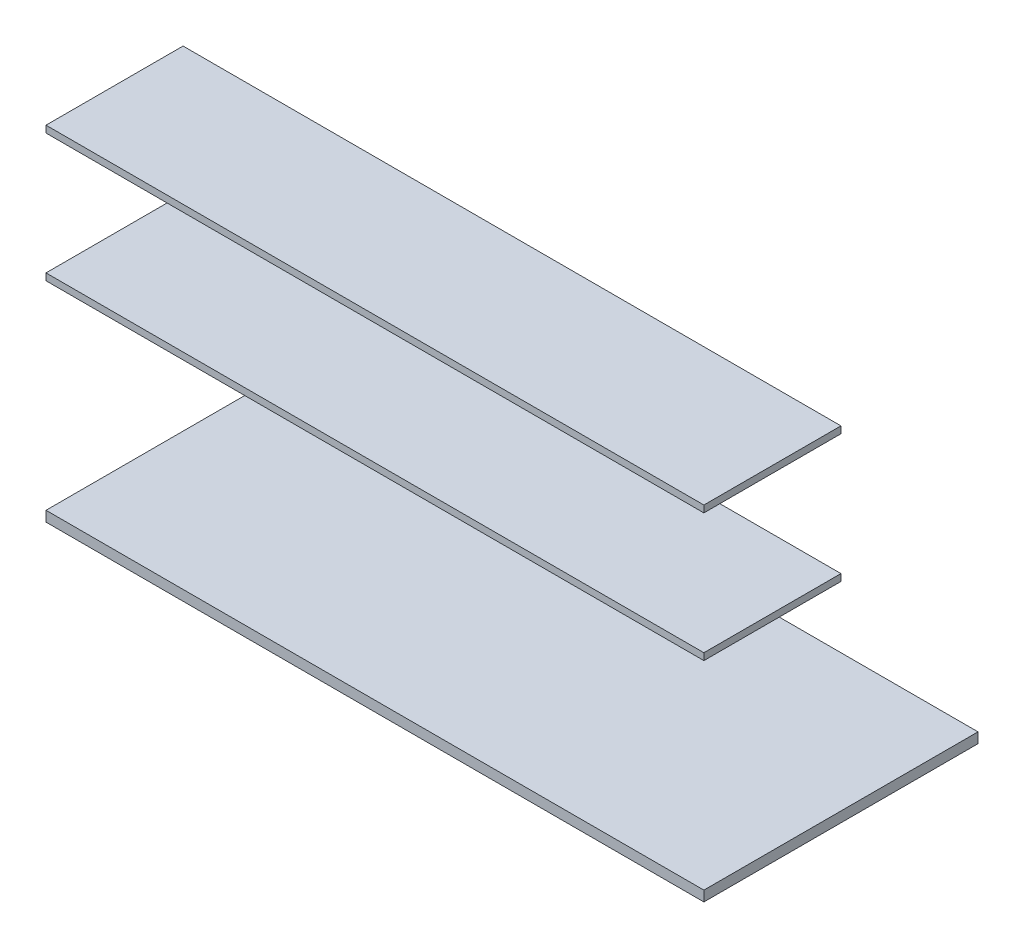
ISO-10303-21;
HEADER;
FILE_DESCRIPTION(('STEP AP214'),'2;1');
FILE_NAME('part.step','',(''),(''),'','','');
FILE_SCHEMA(('AUTOMOTIVE_DESIGN { 1 0 10303 214 1 1 1 1 }'));
ENDSEC;
DATA;
#1=APPLICATION_CONTEXT('core data for automotive mechanical design processes');
#2=APPLICATION_PROTOCOL_DEFINITION('international standard','automotive_design',2000,#1);
#3=PRODUCT_CONTEXT('',#1,'mechanical');
#4=PRODUCT('Part','Part','',(#3));
#5=PRODUCT_RELATED_PRODUCT_CATEGORY('part','',(#4));
#6=PRODUCT_DEFINITION_FORMATION('','',#4);
#7=PRODUCT_DEFINITION_CONTEXT('part definition',#1,'design');
#8=PRODUCT_DEFINITION('design','',#6,#7);
#9=PRODUCT_DEFINITION_SHAPE('','',#8);
#10=(LENGTH_UNIT() NAMED_UNIT(*) SI_UNIT(.MILLI.,.METRE.));
#11=(NAMED_UNIT(*) PLANE_ANGLE_UNIT() SI_UNIT($,.RADIAN.));
#12=(NAMED_UNIT(*) SI_UNIT($,.STERADIAN.) SOLID_ANGLE_UNIT());
#13=UNCERTAINTY_MEASURE_WITH_UNIT(LENGTH_MEASURE(1.E-05),#10,'distance_accuracy_value','');
#14=(GEOMETRIC_REPRESENTATION_CONTEXT(3) GLOBAL_UNCERTAINTY_ASSIGNED_CONTEXT((#13)) GLOBAL_UNIT_ASSIGNED_CONTEXT((#10,
#11,#12)) REPRESENTATION_CONTEXT('',''));
#15=CARTESIAN_POINT('',(0.,0.,0.));
#16=DIRECTION('',(0.,0.,1.));
#17=DIRECTION('',(1.,0.,0.));
#18=AXIS2_PLACEMENT_3D('',#15,#16,#17);
#19=CARTESIAN_POINT('',(-1828.8,936.625,0.));
#20=DIRECTION('',(0.,0.,1.));
#21=DIRECTION('',(1.,0.,0.));
#22=AXIS2_PLACEMENT_3D('',#19,#20,#21);
#23=PLANE('',#22);
#24=DIRECTION('',(0.,-1.,0.));
#25=VECTOR('',#24,1.);
#26=CARTESIAN_POINT('',(0.,936.625,0.));
#27=LINE('',#26,#25);
#28=CARTESIAN_POINT('',(0.,955.675,0.));
#29=VERTEX_POINT('',#28);
#30=CARTESIAN_POINT('',(0.,936.625,0.));
#31=VERTEX_POINT('',#30);
#32=EDGE_CURVE('E109',#29,#31,#27,.T.);
#33=ORIENTED_EDGE('',*,*,#32,.F.);
#34=DIRECTION('',(1.,0.,0.));
#35=VECTOR('',#34,1.);
#36=CARTESIAN_POINT('',(-1828.8,955.675,0.));
#37=LINE('',#36,#35);
#38=CARTESIAN_POINT('',(-1828.8,955.675,0.));
#39=VERTEX_POINT('',#38);
#40=EDGE_CURVE('E12',#39,#29,#37,.T.);
#41=ORIENTED_EDGE('',*,*,#40,.F.);
#42=DIRECTION('',(0.,-1.,0.));
#43=VECTOR('',#42,1.);
#44=CARTESIAN_POINT('',(-1828.8,936.625,0.));
#45=LINE('',#44,#43);
#46=CARTESIAN_POINT('',(-1828.8,936.625,0.));
#47=VERTEX_POINT('',#46);
#48=EDGE_CURVE('E103',#39,#47,#45,.T.);
#49=ORIENTED_EDGE('',*,*,#48,.T.);
#50=DIRECTION('',(1.,0.,0.));
#51=VECTOR('',#50,1.);
#52=CARTESIAN_POINT('',(-1828.8,936.625,0.));
#53=LINE('',#52,#51);
#54=EDGE_CURVE('E48',#47,#31,#53,.T.);
#55=ORIENTED_EDGE('',*,*,#54,.T.);
#56=EDGE_LOOP('',(#33,#41,#49,#55));
#57=FACE_BOUND('',#56,.T.);
#58=ADVANCED_FACE('F45',(#57),#23,.T.);
#59=CARTESIAN_POINT('',(-1828.8,955.675,0.));
#60=DIRECTION('',(0.,1.,0.));
#61=DIRECTION('',(0.,0.,1.));
#62=AXIS2_PLACEMENT_3D('',#59,#60,#61);
#63=PLANE('',#62);
#64=DIRECTION('',(0.,0.,1.));
#65=VECTOR('',#64,1.);
#66=CARTESIAN_POINT('',(0.,955.675,0.));
#67=LINE('',#66,#65);
#68=CARTESIAN_POINT('',(0.,955.675,-381.));
#69=VERTEX_POINT('',#68);
#70=EDGE_CURVE('E105',#69,#29,#67,.T.);
#71=ORIENTED_EDGE('',*,*,#70,.F.);
#72=DIRECTION('',(1.,0.,0.));
#73=VECTOR('',#72,1.);
#74=CARTESIAN_POINT('',(-1828.8,955.675,-381.));
#75=LINE('',#74,#73);
#76=CARTESIAN_POINT('',(-1828.8,955.675,-381.));
#77=VERTEX_POINT('',#76);
#78=EDGE_CURVE('E54',#77,#69,#75,.T.);
#79=ORIENTED_EDGE('',*,*,#78,.F.);
#80=DIRECTION('',(0.,0.,1.));
#81=VECTOR('',#80,1.);
#82=CARTESIAN_POINT('',(-1828.8,955.675,0.));
#83=LINE('',#82,#81);
#84=EDGE_CURVE('E100',#77,#39,#83,.T.);
#85=ORIENTED_EDGE('',*,*,#84,.T.);
#86=ORIENTED_EDGE('',*,*,#40,.T.);
#87=EDGE_LOOP('',(#71,#79,#85,#86));
#88=FACE_BOUND('',#87,.T.);
#89=ADVANCED_FACE('F119',(#88),#63,.T.);
#90=CARTESIAN_POINT('',(-1828.8,936.625,-381.));
#91=DIRECTION('',(0.,0.,-1.));
#92=DIRECTION('',(-1.,0.,0.));
#93=AXIS2_PLACEMENT_3D('',#90,#91,#92);
#94=PLANE('',#93);
#95=DIRECTION('',(0.,1.,0.));
#96=VECTOR('',#95,1.);
#97=CARTESIAN_POINT('',(0.,936.625,-381.));
#98=LINE('',#97,#96);
#99=CARTESIAN_POINT('',(0.,936.625,-381.));
#100=VERTEX_POINT('',#99);
#101=EDGE_CURVE('E95',#100,#69,#98,.T.);
#102=ORIENTED_EDGE('',*,*,#101,.F.);
#103=DIRECTION('',(1.,0.,0.));
#104=VECTOR('',#103,1.);
#105=CARTESIAN_POINT('',(-1828.8,936.625,-381.));
#106=LINE('',#105,#104);
#107=CARTESIAN_POINT('',(-1828.8,936.625,-381.));
#108=VERTEX_POINT('',#107);
#109=EDGE_CURVE('E90',#108,#100,#106,.T.);
#110=ORIENTED_EDGE('',*,*,#109,.F.);
#111=DIRECTION('',(0.,1.,0.));
#112=VECTOR('',#111,1.);
#113=CARTESIAN_POINT('',(-1828.8,936.625,-381.));
#114=LINE('',#113,#112);
#115=EDGE_CURVE('E93',#108,#77,#114,.T.);
#116=ORIENTED_EDGE('',*,*,#115,.T.);
#117=ORIENTED_EDGE('',*,*,#78,.T.);
#118=EDGE_LOOP('',(#102,#110,#116,#117));
#119=FACE_BOUND('',#118,.T.);
#120=ADVANCED_FACE('F92',(#119),#94,.T.);
#121=CARTESIAN_POINT('',(-1828.8,936.625,0.));
#122=DIRECTION('',(0.,-1.,0.));
#123=DIRECTION('',(0.,0.,-1.));
#124=AXIS2_PLACEMENT_3D('',#121,#122,#123);
#125=PLANE('',#124);
#126=DIRECTION('',(0.,0.,-1.));
#127=VECTOR('',#126,1.);
#128=CARTESIAN_POINT('',(0.,936.625,0.));
#129=LINE('',#128,#127);
#130=EDGE_CURVE('E112',#31,#100,#129,.T.);
#131=ORIENTED_EDGE('',*,*,#130,.F.);
#132=ORIENTED_EDGE('',*,*,#54,.F.);
#133=DIRECTION('',(0.,0.,-1.));
#134=VECTOR('',#133,1.);
#135=CARTESIAN_POINT('',(-1828.8,936.625,0.));
#136=LINE('',#135,#134);
#137=EDGE_CURVE('E99',#47,#108,#136,.T.);
#138=ORIENTED_EDGE('',*,*,#137,.T.);
#139=ORIENTED_EDGE('',*,*,#109,.T.);
#140=EDGE_LOOP('',(#131,#132,#138,#139));
#141=FACE_BOUND('',#140,.T.);
#142=ADVANCED_FACE('F102',(#141),#125,.T.);
#143=CARTESIAN_POINT('',(-1828.8,0.,0.));
#144=DIRECTION('',(-1.,0.,0.));
#145=DIRECTION('',(0.,0.,1.));
#146=AXIS2_PLACEMENT_3D('',#143,#144,#145);
#147=PLANE('',#146);
#148=ORIENTED_EDGE('',*,*,#48,.F.);
#149=ORIENTED_EDGE('',*,*,#84,.F.);
#150=ORIENTED_EDGE('',*,*,#115,.F.);
#151=ORIENTED_EDGE('',*,*,#137,.F.);
#152=EDGE_LOOP('',(#148,#149,#150,#151));
#153=FACE_BOUND('',#152,.T.);
#154=ADVANCED_FACE('F98',(#153),#147,.T.);
#155=CARTESIAN_POINT('',(0.,0.,0.));
#156=DIRECTION('',(-1.,0.,0.));
#157=DIRECTION('',(0.,0.,1.));
#158=AXIS2_PLACEMENT_3D('',#155,#156,#157);
#159=PLANE('',#158);
#160=ORIENTED_EDGE('',*,*,#32,.T.);
#161=ORIENTED_EDGE('',*,*,#130,.T.);
#162=ORIENTED_EDGE('',*,*,#101,.T.);
#163=ORIENTED_EDGE('',*,*,#70,.T.);
#164=EDGE_LOOP('',(#160,#161,#162,#163));
#165=FACE_BOUND('',#164,.T.);
#166=ADVANCED_FACE('F118',(#165),#159,.F.);
#167=CLOSED_SHELL('',(#58,#89,#120,#142,#154,#166));
#168=MANIFOLD_SOLID_BREP('B2',#167);
#169=CARTESIAN_POINT('',(-1828.8,581.025,-381.));
#170=DIRECTION('',(0.,-1.,0.));
#171=DIRECTION('',(0.,0.,-1.));
#172=AXIS2_PLACEMENT_3D('',#169,#170,#171);
#173=PLANE('',#172);
#174=DIRECTION('',(0.,0.,-1.));
#175=VECTOR('',#174,1.);
#176=CARTESIAN_POINT('',(0.,581.025,-381.));
#177=LINE('',#176,#175);
#178=CARTESIAN_POINT('',(0.,581.025,0.));
#179=VERTEX_POINT('',#178);
#180=CARTESIAN_POINT('',(0.,581.025,-381.));
#181=VERTEX_POINT('',#180);
#182=EDGE_CURVE('E241',#179,#181,#177,.T.);
#183=ORIENTED_EDGE('',*,*,#182,.F.);
#184=DIRECTION('',(1.,0.,0.));
#185=VECTOR('',#184,1.);
#186=CARTESIAN_POINT('',(-1828.8,581.025,0.));
#187=LINE('',#186,#185);
#188=CARTESIAN_POINT('',(-1828.8,581.025,0.));
#189=VERTEX_POINT('',#188);
#190=EDGE_CURVE('E43',#189,#179,#187,.T.);
#191=ORIENTED_EDGE('',*,*,#190,.F.);
#192=DIRECTION('',(0.,0.,-1.));
#193=VECTOR('',#192,1.);
#194=CARTESIAN_POINT('',(-1828.8,581.025,-381.));
#195=LINE('',#194,#193);
#196=CARTESIAN_POINT('',(-1828.8,581.025,-381.));
#197=VERTEX_POINT('',#196);
#198=EDGE_CURVE('E235',#189,#197,#195,.T.);
#199=ORIENTED_EDGE('',*,*,#198,.T.);
#200=DIRECTION('',(1.,0.,0.));
#201=VECTOR('',#200,1.);
#202=CARTESIAN_POINT('',(-1828.8,581.025,-381.));
#203=LINE('',#202,#201);
#204=EDGE_CURVE('E180',#197,#181,#203,.T.);
#205=ORIENTED_EDGE('',*,*,#204,.T.);
#206=EDGE_LOOP('',(#183,#191,#199,#205));
#207=FACE_BOUND('',#206,.T.);
#208=ADVANCED_FACE('F177',(#207),#173,.T.);
#209=CARTESIAN_POINT('',(-1828.8,581.025,0.));
#210=DIRECTION('',(0.,0.,1.));
#211=DIRECTION('',(0.,-1.,0.));
#212=AXIS2_PLACEMENT_3D('',#209,#210,#211);
#213=PLANE('',#212);
#214=DIRECTION('',(0.,-1.,0.));
#215=VECTOR('',#214,1.);
#216=CARTESIAN_POINT('',(0.,581.025,0.));
#217=LINE('',#216,#215);
#218=CARTESIAN_POINT('',(0.,600.075,0.));
#219=VERTEX_POINT('',#218);
#220=EDGE_CURVE('E237',#219,#179,#217,.T.);
#221=ORIENTED_EDGE('',*,*,#220,.F.);
#222=DIRECTION('',(1.,0.,0.));
#223=VECTOR('',#222,1.);
#224=CARTESIAN_POINT('',(-1828.8,600.075,0.));
#225=LINE('',#224,#223);
#226=CARTESIAN_POINT('',(-1828.8,600.075,0.));
#227=VERTEX_POINT('',#226);
#228=EDGE_CURVE('E186',#227,#219,#225,.T.);
#229=ORIENTED_EDGE('',*,*,#228,.F.);
#230=DIRECTION('',(0.,-1.,0.));
#231=VECTOR('',#230,1.);
#232=CARTESIAN_POINT('',(-1828.8,581.025,0.));
#233=LINE('',#232,#231);
#234=EDGE_CURVE('E232',#227,#189,#233,.T.);
#235=ORIENTED_EDGE('',*,*,#234,.T.);
#236=ORIENTED_EDGE('',*,*,#190,.T.);
#237=EDGE_LOOP('',(#221,#229,#235,#236));
#238=FACE_BOUND('',#237,.T.);
#239=ADVANCED_FACE('F251',(#238),#213,.T.);
#240=CARTESIAN_POINT('',(-1828.8,600.075,0.));
#241=DIRECTION('',(0.,1.,0.));
#242=DIRECTION('',(0.,0.,1.));
#243=AXIS2_PLACEMENT_3D('',#240,#241,#242);
#244=PLANE('',#243);
#245=DIRECTION('',(0.,0.,1.));
#246=VECTOR('',#245,1.);
#247=CARTESIAN_POINT('',(0.,600.075,0.));
#248=LINE('',#247,#246);
#249=CARTESIAN_POINT('',(0.,600.075,-381.));
#250=VERTEX_POINT('',#249);
#251=EDGE_CURVE('E227',#250,#219,#248,.T.);
#252=ORIENTED_EDGE('',*,*,#251,.F.);
#253=DIRECTION('',(1.,0.,0.));
#254=VECTOR('',#253,1.);
#255=CARTESIAN_POINT('',(-1828.8,600.075,-381.));
#256=LINE('',#255,#254);
#257=CARTESIAN_POINT('',(-1828.8,600.075,-381.));
#258=VERTEX_POINT('',#257);
#259=EDGE_CURVE('E222',#258,#250,#256,.T.);
#260=ORIENTED_EDGE('',*,*,#259,.F.);
#261=DIRECTION('',(0.,0.,1.));
#262=VECTOR('',#261,1.);
#263=CARTESIAN_POINT('',(-1828.8,600.075,0.));
#264=LINE('',#263,#262);
#265=EDGE_CURVE('E225',#258,#227,#264,.T.);
#266=ORIENTED_EDGE('',*,*,#265,.T.);
#267=ORIENTED_EDGE('',*,*,#228,.T.);
#268=EDGE_LOOP('',(#252,#260,#266,#267));
#269=FACE_BOUND('',#268,.T.);
#270=ADVANCED_FACE('F224',(#269),#244,.T.);
#271=CARTESIAN_POINT('',(-1828.8,600.075,-381.));
#272=DIRECTION('',(0.,0.,-1.));
#273=DIRECTION('',(-1.,0.,0.));
#274=AXIS2_PLACEMENT_3D('',#271,#272,#273);
#275=PLANE('',#274);
#276=DIRECTION('',(0.,1.,0.));
#277=VECTOR('',#276,1.);
#278=CARTESIAN_POINT('',(0.,600.075,-381.));
#279=LINE('',#278,#277);
#280=EDGE_CURVE('E244',#181,#250,#279,.T.);
#281=ORIENTED_EDGE('',*,*,#280,.F.);
#282=ORIENTED_EDGE('',*,*,#204,.F.);
#283=DIRECTION('',(0.,1.,0.));
#284=VECTOR('',#283,1.);
#285=CARTESIAN_POINT('',(-1828.8,600.075,-381.));
#286=LINE('',#285,#284);
#287=EDGE_CURVE('E231',#197,#258,#286,.T.);
#288=ORIENTED_EDGE('',*,*,#287,.T.);
#289=ORIENTED_EDGE('',*,*,#259,.T.);
#290=EDGE_LOOP('',(#281,#282,#288,#289));
#291=FACE_BOUND('',#290,.T.);
#292=ADVANCED_FACE('F234',(#291),#275,.T.);
#293=CARTESIAN_POINT('',(-1828.8,0.,0.));
#294=DIRECTION('',(-1.,0.,0.));
#295=DIRECTION('',(0.,0.,1.));
#296=AXIS2_PLACEMENT_3D('',#293,#294,#295);
#297=PLANE('',#296);
#298=ORIENTED_EDGE('',*,*,#198,.F.);
#299=ORIENTED_EDGE('',*,*,#234,.F.);
#300=ORIENTED_EDGE('',*,*,#265,.F.);
#301=ORIENTED_EDGE('',*,*,#287,.F.);
#302=EDGE_LOOP('',(#298,#299,#300,#301));
#303=FACE_BOUND('',#302,.T.);
#304=ADVANCED_FACE('F230',(#303),#297,.T.);
#305=CARTESIAN_POINT('',(0.,0.,0.));
#306=DIRECTION('',(-1.,0.,0.));
#307=DIRECTION('',(0.,0.,1.));
#308=AXIS2_PLACEMENT_3D('',#305,#306,#307);
#309=PLANE('',#308);
#310=ORIENTED_EDGE('',*,*,#182,.T.);
#311=ORIENTED_EDGE('',*,*,#280,.T.);
#312=ORIENTED_EDGE('',*,*,#251,.T.);
#313=ORIENTED_EDGE('',*,*,#220,.T.);
#314=EDGE_LOOP('',(#310,#311,#312,#313));
#315=FACE_BOUND('',#314,.T.);
#316=ADVANCED_FACE('F250',(#315),#309,.F.);
#317=CLOSED_SHELL('',(#208,#239,#270,#292,#304,#316));
#318=MANIFOLD_SOLID_BREP('B6',#317);
#319=CARTESIAN_POINT('',(-1828.8,28.575,0.));
#320=DIRECTION('',(0.,0.,1.));
#321=DIRECTION('',(0.,-1.,0.));
#322=AXIS2_PLACEMENT_3D('',#319,#320,#321);
#323=PLANE('',#322);
#324=DIRECTION('',(0.,-1.,0.));
#325=VECTOR('',#324,1.);
#326=CARTESIAN_POINT('',(0.,28.575,0.));
#327=LINE('',#326,#325);
#328=CARTESIAN_POINT('',(0.,28.575,0.));
#329=VERTEX_POINT('',#328);
#330=CARTESIAN_POINT('',(0.,0.,0.));
#331=VERTEX_POINT('',#330);
#332=EDGE_CURVE('E364',#329,#331,#327,.T.);
#333=ORIENTED_EDGE('',*,*,#332,.F.);
#334=DIRECTION('',(1.,0.,0.));
#335=VECTOR('',#334,1.);
#336=CARTESIAN_POINT('',(-1828.8,28.575,0.));
#337=LINE('',#336,#335);
#338=CARTESIAN_POINT('',(-1828.8,28.575,0.));
#339=VERTEX_POINT('',#338);
#340=EDGE_CURVE('E175',#339,#329,#337,.T.);
#341=ORIENTED_EDGE('',*,*,#340,.F.);
#342=DIRECTION('',(0.,-1.,0.));
#343=VECTOR('',#342,1.);
#344=CARTESIAN_POINT('',(-1828.8,28.575,0.));
#345=LINE('',#344,#343);
#346=CARTESIAN_POINT('',(-1828.8,0.,0.));
#347=VERTEX_POINT('',#346);
#348=EDGE_CURVE('E358',#339,#347,#345,.T.);
#349=ORIENTED_EDGE('',*,*,#348,.T.);
#350=DIRECTION('',(1.,0.,0.));
#351=VECTOR('',#350,1.);
#352=CARTESIAN_POINT('',(-1828.8,0.,0.));
#353=LINE('',#352,#351);
#354=EDGE_CURVE('E303',#347,#331,#353,.T.);
#355=ORIENTED_EDGE('',*,*,#354,.T.);
#356=EDGE_LOOP('',(#333,#341,#349,#355));
#357=FACE_BOUND('',#356,.T.);
#358=ADVANCED_FACE('F300',(#357),#323,.T.);
#359=CARTESIAN_POINT('',(-1828.8,28.5750000000001,-762.));
#360=DIRECTION('',(0.,1.,0.));
#361=DIRECTION('',(0.,0.,1.));
#362=AXIS2_PLACEMENT_3D('',#359,#360,#361);
#363=PLANE('',#362);
#364=DIRECTION('',(0.,0.,1.));
#365=VECTOR('',#364,1.);
#366=CARTESIAN_POINT('',(0.,28.5750000000001,-762.));
#367=LINE('',#366,#365);
#368=CARTESIAN_POINT('',(0.,28.5750000000001,-762.));
#369=VERTEX_POINT('',#368);
#370=EDGE_CURVE('E360',#369,#329,#367,.T.);
#371=ORIENTED_EDGE('',*,*,#370,.F.);
#372=DIRECTION('',(1.,0.,0.));
#373=VECTOR('',#372,1.);
#374=CARTESIAN_POINT('',(-1828.8,28.5750000000001,-762.));
#375=LINE('',#374,#373);
#376=CARTESIAN_POINT('',(-1828.8,28.5750000000001,-762.));
#377=VERTEX_POINT('',#376);
#378=EDGE_CURVE('E309',#377,#369,#375,.T.);
#379=ORIENTED_EDGE('',*,*,#378,.F.);
#380=DIRECTION('',(0.,0.,1.));
#381=VECTOR('',#380,1.);
#382=CARTESIAN_POINT('',(-1828.8,28.5750000000001,-762.));
#383=LINE('',#382,#381);
#384=EDGE_CURVE('E355',#377,#339,#383,.T.);
#385=ORIENTED_EDGE('',*,*,#384,.T.);
#386=ORIENTED_EDGE('',*,*,#340,.T.);
#387=EDGE_LOOP('',(#371,#379,#385,#386));
#388=FACE_BOUND('',#387,.T.);
#389=ADVANCED_FACE('F374',(#388),#363,.T.);
#390=CARTESIAN_POINT('',(-1828.8,0.,-762.));
#391=DIRECTION('',(0.,0.,-1.));
#392=DIRECTION('',(-1.,0.,0.));
#393=AXIS2_PLACEMENT_3D('',#390,#391,#392);
#394=PLANE('',#393);
#395=DIRECTION('',(0.,1.,0.));
#396=VECTOR('',#395,1.);
#397=CARTESIAN_POINT('',(0.,0.,-762.));
#398=LINE('',#397,#396);
#399=CARTESIAN_POINT('',(0.,0.,-762.));
#400=VERTEX_POINT('',#399);
#401=EDGE_CURVE('E350',#400,#369,#398,.T.);
#402=ORIENTED_EDGE('',*,*,#401,.F.);
#403=DIRECTION('',(1.,0.,0.));
#404=VECTOR('',#403,1.);
#405=CARTESIAN_POINT('',(-1828.8,0.,-762.));
#406=LINE('',#405,#404);
#407=CARTESIAN_POINT('',(-1828.8,0.,-762.));
#408=VERTEX_POINT('',#407);
#409=EDGE_CURVE('E345',#408,#400,#406,.T.);
#410=ORIENTED_EDGE('',*,*,#409,.F.);
#411=DIRECTION('',(0.,1.,0.));
#412=VECTOR('',#411,1.);
#413=CARTESIAN_POINT('',(-1828.8,0.,-762.));
#414=LINE('',#413,#412);
#415=EDGE_CURVE('E348',#408,#377,#414,.T.);
#416=ORIENTED_EDGE('',*,*,#415,.T.);
#417=ORIENTED_EDGE('',*,*,#378,.T.);
#418=EDGE_LOOP('',(#402,#410,#416,#417));
#419=FACE_BOUND('',#418,.T.);
#420=ADVANCED_FACE('F347',(#419),#394,.T.);
#421=CARTESIAN_POINT('',(-1828.8,0.,0.));
#422=DIRECTION('',(0.,-1.,0.));
#423=DIRECTION('',(0.,0.,-1.));
#424=AXIS2_PLACEMENT_3D('',#421,#422,#423);
#425=PLANE('',#424);
#426=DIRECTION('',(0.,0.,-1.));
#427=VECTOR('',#426,1.);
#428=CARTESIAN_POINT('',(0.,0.,0.));
#429=LINE('',#428,#427);
#430=EDGE_CURVE('E367',#331,#400,#429,.T.);
#431=ORIENTED_EDGE('',*,*,#430,.F.);
#432=ORIENTED_EDGE('',*,*,#354,.F.);
#433=DIRECTION('',(0.,0.,-1.));
#434=VECTOR('',#433,1.);
#435=CARTESIAN_POINT('',(-1828.8,0.,0.));
#436=LINE('',#435,#434);
#437=EDGE_CURVE('E354',#347,#408,#436,.T.);
#438=ORIENTED_EDGE('',*,*,#437,.T.);
#439=ORIENTED_EDGE('',*,*,#409,.T.);
#440=EDGE_LOOP('',(#431,#432,#438,#439));
#441=FACE_BOUND('',#440,.T.);
#442=ADVANCED_FACE('F357',(#441),#425,.T.);
#443=CARTESIAN_POINT('',(-1828.8,0.,0.));
#444=DIRECTION('',(1.,0.,0.));
#445=DIRECTION('',(0.,0.,-1.));
#446=AXIS2_PLACEMENT_3D('',#443,#444,#445);
#447=PLANE('',#446);
#448=ORIENTED_EDGE('',*,*,#348,.F.);
#449=ORIENTED_EDGE('',*,*,#384,.F.);
#450=ORIENTED_EDGE('',*,*,#415,.F.);
#451=ORIENTED_EDGE('',*,*,#437,.F.);
#452=EDGE_LOOP('',(#448,#449,#450,#451));
#453=FACE_BOUND('',#452,.T.);
#454=ADVANCED_FACE('F353',(#453),#447,.F.);
#455=CARTESIAN_POINT('',(0.,0.,0.));
#456=DIRECTION('',(1.,0.,0.));
#457=DIRECTION('',(0.,0.,-1.));
#458=AXIS2_PLACEMENT_3D('',#455,#456,#457);
#459=PLANE('',#458);
#460=ORIENTED_EDGE('',*,*,#332,.T.);
#461=ORIENTED_EDGE('',*,*,#430,.T.);
#462=ORIENTED_EDGE('',*,*,#401,.T.);
#463=ORIENTED_EDGE('',*,*,#370,.T.);
#464=EDGE_LOOP('',(#460,#461,#462,#463));
#465=FACE_BOUND('',#464,.T.);
#466=ADVANCED_FACE('F373',(#465),#459,.T.);
#467=CLOSED_SHELL('',(#358,#389,#420,#442,#454,#466));
#468=MANIFOLD_SOLID_BREP('B37',#467);
#469=ADVANCED_BREP_SHAPE_REPRESENTATION('',(#18,#168,#318,#468),#14);
#470=SHAPE_DEFINITION_REPRESENTATION(#9,#469);
ENDSEC;
END-ISO-10303-21;
